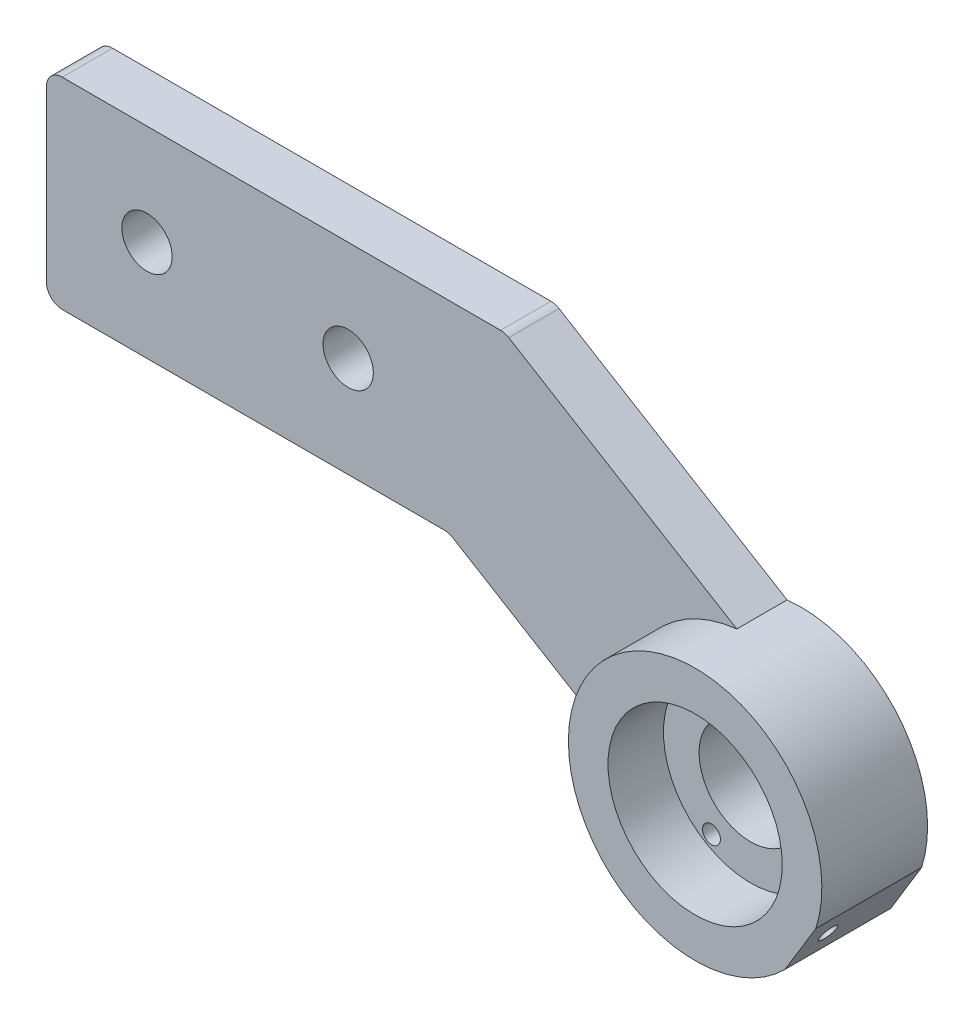
ISO-10303-21;
HEADER;
FILE_DESCRIPTION(('STEP AP214'),'2;1');
FILE_NAME('part.step','',(''),(''),'','','');
FILE_SCHEMA(('AUTOMOTIVE_DESIGN { 1 0 10303 214 1 1 1 1 }'));
ENDSEC;
DATA;
#1=APPLICATION_CONTEXT('core data for automotive mechanical design processes');
#2=APPLICATION_PROTOCOL_DEFINITION('international standard','automotive_design',2000,#1);
#3=PRODUCT_CONTEXT('',#1,'mechanical');
#4=PRODUCT('Part','Part','',(#3));
#5=PRODUCT_RELATED_PRODUCT_CATEGORY('part','',(#4));
#6=PRODUCT_DEFINITION_FORMATION('','',#4);
#7=PRODUCT_DEFINITION_CONTEXT('part definition',#1,'design');
#8=PRODUCT_DEFINITION('design','',#6,#7);
#9=PRODUCT_DEFINITION_SHAPE('','',#8);
#10=(LENGTH_UNIT() NAMED_UNIT(*) SI_UNIT(.MILLI.,.METRE.));
#11=(NAMED_UNIT(*) PLANE_ANGLE_UNIT() SI_UNIT($,.RADIAN.));
#12=(NAMED_UNIT(*) SI_UNIT($,.STERADIAN.) SOLID_ANGLE_UNIT());
#13=UNCERTAINTY_MEASURE_WITH_UNIT(LENGTH_MEASURE(1.E-05),#10,'distance_accuracy_value','');
#14=(GEOMETRIC_REPRESENTATION_CONTEXT(3) GLOBAL_UNCERTAINTY_ASSIGNED_CONTEXT((#13)) GLOBAL_UNIT_ASSIGNED_CONTEXT((#10,
#11,#12)) REPRESENTATION_CONTEXT('',''));
#15=CARTESIAN_POINT('',(0.,0.,0.));
#16=DIRECTION('',(0.,0.,1.));
#17=DIRECTION('',(1.,0.,0.));
#18=AXIS2_PLACEMENT_3D('',#15,#16,#17);
#19=CARTESIAN_POINT('',(50.8,-20.95,6.35));
#20=DIRECTION('',(0.,0.,-1.));
#21=DIRECTION('',(-1.,0.,0.));
#22=AXIS2_PLACEMENT_3D('',#19,#20,#21);
#23=PLANE('',#22);
#24=CARTESIAN_POINT('',(45.8613890575843,-29.0946759886107,6.35));
#25=DIRECTION('',(0.,0.,1.));
#26=DIRECTION('',(1.,0.,0.));
#27=AXIS2_PLACEMENT_3D('',#24,#25,#26);
#28=CIRCLE('',#27,1.1303);
#29=CARTESIAN_POINT('',(46.9916890575843,-29.0946759886107,6.35));
#30=VERTEX_POINT('',#29);
#31=EDGE_CURVE('E161',#30,#30,#28,.T.);
#32=ORIENTED_EDGE('',*,*,#31,.F.);
#33=EDGE_LOOP('',(#32));
#34=FACE_BOUND('',#33,.T.);
#35=CARTESIAN_POINT('',(55.7386109424157,-12.8053240113893,6.35));
#36=DIRECTION('',(0.,0.,1.));
#37=DIRECTION('',(1.,0.,0.));
#38=AXIS2_PLACEMENT_3D('',#35,#36,#37);
#39=CIRCLE('',#38,1.1303);
#40=CARTESIAN_POINT('',(56.8689109424157,-12.8053240113893,6.35));
#41=VERTEX_POINT('',#40);
#42=EDGE_CURVE('E167',#41,#41,#39,.T.);
#43=ORIENTED_EDGE('',*,*,#42,.F.);
#44=EDGE_LOOP('',(#43));
#45=FACE_BOUND('',#44,.T.);
#46=CARTESIAN_POINT('',(50.8,-20.95,6.35));
#47=DIRECTION('',(0.,0.,1.));
#48=DIRECTION('',(1.,0.,0.));
#49=AXIS2_PLACEMENT_3D('',#46,#47,#48);
#50=CIRCLE('',#49,6.5);
#51=CARTESIAN_POINT('',(57.3,-20.95,6.35));
#52=VERTEX_POINT('',#51);
#53=EDGE_CURVE('E179',#52,#52,#50,.T.);
#54=ORIENTED_EDGE('',*,*,#53,.F.);
#55=EDGE_LOOP('',(#54));
#56=FACE_BOUND('',#55,.T.);
#57=CARTESIAN_POINT('',(50.8,-20.95,6.35));
#58=DIRECTION('',(0.,0.,1.));
#59=DIRECTION('',(1.,0.,0.));
#60=AXIS2_PLACEMENT_3D('',#57,#58,#59);
#61=CIRCLE('',#60,11.);
#62=CARTESIAN_POINT('',(61.8,-20.95,6.35));
#63=VERTEX_POINT('',#62);
#64=EDGE_CURVE('E151',#63,#63,#61,.T.);
#65=ORIENTED_EDGE('',*,*,#64,.T.);
#66=EDGE_LOOP('',(#65));
#67=FACE_BOUND('',#66,.T.);
#68=ADVANCED_FACE('F34',(#34,#45,#56,#67),#23,.F.);
#69=CARTESIAN_POINT('',(50.8,-20.95,6.35));
#70=DIRECTION('',(0.,0.,1.));
#71=DIRECTION('',(1.,0.,0.));
#72=AXIS2_PLACEMENT_3D('',#69,#70,#71);
#73=CIRCLE('',#72,16.);
#74=CARTESIAN_POINT('',(49.0632163255362,-5.04454236847881,6.35));
#75=VERTEX_POINT('',#74);
#76=CARTESIAN_POINT('',(35.893587145761,-26.7636783381074,6.35));
#77=VERTEX_POINT('',#76);
#78=EDGE_CURVE('E12',#75,#77,#73,.T.);
#79=ORIENTED_EDGE('',*,*,#78,.F.);
#80=DIRECTION('',(-0.855084093292463,0.518489337786426,0.));
#81=VECTOR('',#80,1.);
#82=CARTESIAN_POINT('',(19.7992087244958,12.7,6.35));
#83=LINE('',#82,#81);
#84=CARTESIAN_POINT('',(20.2771945871162,12.4101681865849,6.35));
#85=VERTEX_POINT('',#84);
#86=EDGE_CURVE('E191',#75,#85,#83,.T.);
#87=ORIENTED_EDGE('',*,*,#86,.T.);
#88=CARTESIAN_POINT('',(19.2402159115434,10.7,6.35));
#89=DIRECTION('',(0.,0.,-1.));
#90=DIRECTION('',(-1.,0.,0.));
#91=AXIS2_PLACEMENT_3D('',#88,#89,#90);
#92=CIRCLE('',#91,2.);
#93=CARTESIAN_POINT('',(19.2402159115434,12.7,6.35));
#94=VERTEX_POINT('',#93);
#95=EDGE_CURVE('E235',#85,#94,#92,.F.);
#96=ORIENTED_EDGE('',*,*,#95,.T.);
#97=DIRECTION('',(-1.,0.,0.));
#98=VECTOR('',#97,1.);
#99=CARTESIAN_POINT('',(19.7992087244958,12.7,6.35));
#100=LINE('',#99,#98);
#101=CARTESIAN_POINT('',(-36.1,12.7,6.35));
#102=VERTEX_POINT('',#101);
#103=EDGE_CURVE('E194',#94,#102,#100,.T.);
#104=ORIENTED_EDGE('',*,*,#103,.T.);
#105=CARTESIAN_POINT('',(-36.1,10.7,6.35));
#106=DIRECTION('',(0.,0.,-1.));
#107=DIRECTION('',(-1.,0.,0.));
#108=AXIS2_PLACEMENT_3D('',#105,#106,#107);
#109=CIRCLE('',#108,2.);
#110=CARTESIAN_POINT('',(-38.1,10.7,6.35));
#111=VERTEX_POINT('',#110);
#112=EDGE_CURVE('E57',#102,#111,#109,.F.);
#113=ORIENTED_EDGE('',*,*,#112,.T.);
#114=DIRECTION('',(0.,-1.,0.));
#115=VECTOR('',#114,1.);
#116=CARTESIAN_POINT('',(-38.1,-12.7,6.35));
#117=LINE('',#116,#115);
#118=CARTESIAN_POINT('',(-38.1,-10.7,6.35));
#119=VERTEX_POINT('',#118);
#120=EDGE_CURVE('E196',#111,#119,#117,.T.);
#121=ORIENTED_EDGE('',*,*,#120,.T.);
#122=CARTESIAN_POINT('',(-36.1,-10.7,6.35));
#123=DIRECTION('',(0.,0.,-1.));
#124=DIRECTION('',(-1.,0.,0.));
#125=AXIS2_PLACEMENT_3D('',#122,#123,#124);
#126=CIRCLE('',#125,2.);
#127=CARTESIAN_POINT('',(-36.1,-12.7,6.35));
#128=VERTEX_POINT('',#127);
#129=EDGE_CURVE('E233',#119,#128,#126,.F.);
#130=ORIENTED_EDGE('',*,*,#129,.T.);
#131=DIRECTION('',(1.,0.,0.));
#132=VECTOR('',#131,1.);
#133=CARTESIAN_POINT('',(12.7,-12.7,6.35));
#134=LINE('',#133,#132);
#135=CARTESIAN_POINT('',(12.1410071870476,-12.7,6.35));
#136=VERTEX_POINT('',#135);
#137=EDGE_CURVE('E185',#128,#136,#134,.T.);
#138=ORIENTED_EDGE('',*,*,#137,.T.);
#139=CARTESIAN_POINT('',(12.1410071870476,-14.7,6.35));
#140=DIRECTION('',(0.,0.,-1.));
#141=DIRECTION('',(-1.,0.,0.));
#142=AXIS2_PLACEMENT_3D('',#139,#140,#141);
#143=CIRCLE('',#142,2.);
#144=CARTESIAN_POINT('',(13.1779858626204,-12.9898318134151,6.35));
#145=VERTEX_POINT('',#144);
#146=EDGE_CURVE('E38',#136,#145,#143,.T.);
#147=ORIENTED_EDGE('',*,*,#146,.T.);
#148=DIRECTION('',(0.855084093292463,-0.518489337786426,0.));
#149=VECTOR('',#148,1.);
#150=CARTESIAN_POINT('',(12.7,-12.7,6.35));
#151=LINE('',#150,#149);
#152=EDGE_CURVE('E188',#145,#77,#151,.T.);
#153=ORIENTED_EDGE('',*,*,#152,.T.);
#154=EDGE_LOOP('',(#79,#87,#96,#104,#113,#121,#130,#138,#147,#153));
#155=FACE_BOUND('',#154,.T.);
#156=CARTESIAN_POINT('',(-25.4,0.,6.35));
#157=DIRECTION('',(0.,0.,1.));
#158=DIRECTION('',(1.,0.,0.));
#159=AXIS2_PLACEMENT_3D('',#156,#157,#158);
#160=CIRCLE('',#159,3.175);
#161=CARTESIAN_POINT('',(-22.225,0.,6.35));
#162=VERTEX_POINT('',#161);
#163=EDGE_CURVE('E173',#162,#162,#160,.T.);
#164=ORIENTED_EDGE('',*,*,#163,.F.);
#165=EDGE_LOOP('',(#164));
#166=FACE_BOUND('',#165,.T.);
#167=CARTESIAN_POINT('',(0.,0.,6.35));
#168=DIRECTION('',(0.,0.,1.));
#169=DIRECTION('',(1.,0.,0.));
#170=AXIS2_PLACEMENT_3D('',#167,#168,#169);
#171=CIRCLE('',#170,3.175);
#172=CARTESIAN_POINT('',(3.175,0.,6.35));
#173=VERTEX_POINT('',#172);
#174=EDGE_CURVE('E155',#173,#173,#171,.T.);
#175=ORIENTED_EDGE('',*,*,#174,.F.);
#176=EDGE_LOOP('',(#175));
#177=FACE_BOUND('',#176,.T.);
#178=ADVANCED_FACE('F254',(#155,#166,#177),#23,.F.);
#179=CARTESIAN_POINT('',(50.8,-20.95,0.));
#180=DIRECTION('',(0.,0.,-1.));
#181=DIRECTION('',(-1.,0.,0.));
#182=AXIS2_PLACEMENT_3D('',#179,#180,#181);
#183=PLANE('',#182);
#184=CARTESIAN_POINT('',(45.8613890575843,-29.0946759886107,0.));
#185=DIRECTION('',(0.,0.,1.));
#186=DIRECTION('',(1.,0.,0.));
#187=AXIS2_PLACEMENT_3D('',#184,#185,#186);
#188=CIRCLE('',#187,1.1303);
#189=CARTESIAN_POINT('',(46.9916890575843,-29.0946759886107,0.));
#190=VERTEX_POINT('',#189);
#191=EDGE_CURVE('E158',#190,#190,#188,.T.);
#192=ORIENTED_EDGE('',*,*,#191,.T.);
#193=EDGE_LOOP('',(#192));
#194=FACE_BOUND('',#193,.T.);
#195=CARTESIAN_POINT('',(-25.4,0.,0.));
#196=DIRECTION('',(0.,0.,1.));
#197=DIRECTION('',(1.,0.,0.));
#198=AXIS2_PLACEMENT_3D('',#195,#196,#197);
#199=CIRCLE('',#198,3.175);
#200=CARTESIAN_POINT('',(-22.225,0.,0.));
#201=VERTEX_POINT('',#200);
#202=EDGE_CURVE('E170',#201,#201,#199,.T.);
#203=ORIENTED_EDGE('',*,*,#202,.T.);
#204=EDGE_LOOP('',(#203));
#205=FACE_BOUND('',#204,.T.);
#206=DIRECTION('',(-1.,0.,0.));
#207=VECTOR('',#206,1.);
#208=CARTESIAN_POINT('',(19.7992087244958,12.7,0.));
#209=LINE('',#208,#207);
#210=CARTESIAN_POINT('',(19.2402159115434,12.7,0.));
#211=VERTEX_POINT('',#210);
#212=CARTESIAN_POINT('',(-36.1,12.7,0.));
#213=VERTEX_POINT('',#212);
#214=EDGE_CURVE('E211',#211,#213,#209,.T.);
#215=ORIENTED_EDGE('',*,*,#214,.F.);
#216=CARTESIAN_POINT('',(19.2402159115434,10.7,0.));
#217=DIRECTION('',(0.,0.,-1.));
#218=DIRECTION('',(-1.,0.,0.));
#219=AXIS2_PLACEMENT_3D('',#216,#217,#218);
#220=CIRCLE('',#219,2.);
#221=CARTESIAN_POINT('',(20.2771945871162,12.4101681865849,0.));
#222=VERTEX_POINT('',#221);
#223=EDGE_CURVE('E228',#211,#222,#220,.T.);
#224=ORIENTED_EDGE('',*,*,#223,.T.);
#225=DIRECTION('',(-0.855084093292463,0.518489337786426,0.));
#226=VECTOR('',#225,1.);
#227=CARTESIAN_POINT('',(19.7992087244958,12.7,0.));
#228=LINE('',#227,#226);
#229=CARTESIAN_POINT('',(49.0632163255362,-5.04454236847881,0.));
#230=VERTEX_POINT('',#229);
#231=EDGE_CURVE('E208',#230,#222,#228,.T.);
#232=ORIENTED_EDGE('',*,*,#231,.F.);
#233=CARTESIAN_POINT('',(50.8,-20.95,0.));
#234=DIRECTION('',(0.,0.,1.));
#235=DIRECTION('',(-1.,0.,0.));
#236=AXIS2_PLACEMENT_3D('',#233,#234,#235);
#237=CIRCLE('',#236,16.);
#238=CARTESIAN_POINT('',(66.0446039292896,-25.8081942158675,0.));
#239=VERTEX_POINT('',#238);
#240=EDGE_CURVE('E206',#239,#230,#237,.T.);
#241=ORIENTED_EDGE('',*,*,#240,.F.);
#242=DIRECTION('',(0.518489337786426,0.855084093292463,0.));
#243=VECTOR('',#242,1.);
#244=CARTESIAN_POINT('',(66.0446039292896,-25.8081942158675,0.));
#245=LINE('',#244,#243);
#246=CARTESIAN_POINT('',(62.1559338958914,-32.2213249155609,0.));
#247=VERTEX_POINT('',#246);
#248=EDGE_CURVE('E204',#247,#239,#245,.T.);
#249=ORIENTED_EDGE('',*,*,#248,.F.);
#250=CARTESIAN_POINT('',(50.8,-20.95,0.));
#251=DIRECTION('',(0.,0.,1.));
#252=DIRECTION('',(-1.,0.,0.));
#253=AXIS2_PLACEMENT_3D('',#250,#251,#252);
#254=CIRCLE('',#253,16.);
#255=CARTESIAN_POINT('',(35.893587145761,-26.7636783381074,0.));
#256=VERTEX_POINT('',#255);
#257=EDGE_CURVE('E134',#256,#247,#254,.T.);
#258=ORIENTED_EDGE('',*,*,#257,.F.);
#259=DIRECTION('',(0.855084093292463,-0.518489337786426,0.));
#260=VECTOR('',#259,1.);
#261=CARTESIAN_POINT('',(12.7,-12.7,0.));
#262=LINE('',#261,#260);
#263=CARTESIAN_POINT('',(13.1779858626204,-12.9898318134151,0.));
#264=VERTEX_POINT('',#263);
#265=EDGE_CURVE('E201',#264,#256,#262,.T.);
#266=ORIENTED_EDGE('',*,*,#265,.F.);
#267=CARTESIAN_POINT('',(12.1410071870476,-14.7,0.));
#268=DIRECTION('',(0.,0.,-1.));
#269=DIRECTION('',(-1.,0.,0.));
#270=AXIS2_PLACEMENT_3D('',#267,#268,#269);
#271=CIRCLE('',#270,2.);
#272=CARTESIAN_POINT('',(12.1410071870476,-12.7,0.));
#273=VERTEX_POINT('',#272);
#274=EDGE_CURVE('E248',#264,#273,#271,.F.);
#275=ORIENTED_EDGE('',*,*,#274,.T.);
#276=DIRECTION('',(1.,0.,0.));
#277=VECTOR('',#276,1.);
#278=CARTESIAN_POINT('',(12.7,-12.7,0.));
#279=LINE('',#278,#277);
#280=CARTESIAN_POINT('',(-36.1,-12.7,0.));
#281=VERTEX_POINT('',#280);
#282=EDGE_CURVE('E182',#281,#273,#279,.T.);
#283=ORIENTED_EDGE('',*,*,#282,.F.);
#284=CARTESIAN_POINT('',(-36.1,-10.7,0.));
#285=DIRECTION('',(0.,0.,-1.));
#286=DIRECTION('',(-1.,0.,0.));
#287=AXIS2_PLACEMENT_3D('',#284,#285,#286);
#288=CIRCLE('',#287,2.);
#289=CARTESIAN_POINT('',(-38.1,-10.7,0.));
#290=VERTEX_POINT('',#289);
#291=EDGE_CURVE('E226',#281,#290,#288,.T.);
#292=ORIENTED_EDGE('',*,*,#291,.T.);
#293=DIRECTION('',(0.,-1.,0.));
#294=VECTOR('',#293,1.);
#295=CARTESIAN_POINT('',(-38.1,-12.7,0.));
#296=LINE('',#295,#294);
#297=CARTESIAN_POINT('',(-38.1,10.7,0.));
#298=VERTEX_POINT('',#297);
#299=EDGE_CURVE('E189',#298,#290,#296,.T.);
#300=ORIENTED_EDGE('',*,*,#299,.F.);
#301=CARTESIAN_POINT('',(-36.1,10.7,0.));
#302=DIRECTION('',(0.,0.,-1.));
#303=DIRECTION('',(-1.,0.,0.));
#304=AXIS2_PLACEMENT_3D('',#301,#302,#303);
#305=CIRCLE('',#304,2.);
#306=EDGE_CURVE('E224',#298,#213,#305,.T.);
#307=ORIENTED_EDGE('',*,*,#306,.T.);
#308=EDGE_LOOP('',(#215,#224,#232,#241,#249,#258,#266,#275,#283,#292,#300,#307));
#309=FACE_BOUND('',#308,.T.);
#310=CARTESIAN_POINT('',(50.8,-20.95,0.));
#311=DIRECTION('',(0.,0.,1.));
#312=DIRECTION('',(1.,0.,0.));
#313=AXIS2_PLACEMENT_3D('',#310,#311,#312);
#314=CIRCLE('',#313,6.5);
#315=CARTESIAN_POINT('',(57.3,-20.95,0.));
#316=VERTEX_POINT('',#315);
#317=EDGE_CURVE('E176',#316,#316,#314,.T.);
#318=ORIENTED_EDGE('',*,*,#317,.T.);
#319=EDGE_LOOP('',(#318));
#320=FACE_BOUND('',#319,.T.);
#321=CARTESIAN_POINT('',(55.7386109424157,-12.8053240113893,0.));
#322=DIRECTION('',(0.,0.,1.));
#323=DIRECTION('',(1.,0.,0.));
#324=AXIS2_PLACEMENT_3D('',#321,#322,#323);
#325=CIRCLE('',#324,1.1303);
#326=CARTESIAN_POINT('',(56.8689109424157,-12.8053240113893,0.));
#327=VERTEX_POINT('',#326);
#328=EDGE_CURVE('E164',#327,#327,#325,.T.);
#329=ORIENTED_EDGE('',*,*,#328,.T.);
#330=EDGE_LOOP('',(#329));
#331=FACE_BOUND('',#330,.T.);
#332=CARTESIAN_POINT('',(0.,0.,0.));
#333=DIRECTION('',(0.,0.,1.));
#334=DIRECTION('',(1.,0.,0.));
#335=AXIS2_PLACEMENT_3D('',#332,#333,#334);
#336=CIRCLE('',#335,3.175);
#337=CARTESIAN_POINT('',(3.175,0.,0.));
#338=VERTEX_POINT('',#337);
#339=EDGE_CURVE('E144',#338,#338,#336,.T.);
#340=ORIENTED_EDGE('',*,*,#339,.T.);
#341=EDGE_LOOP('',(#340));
#342=FACE_BOUND('',#341,.T.);
#343=ADVANCED_FACE('F268',(#194,#205,#309,#320,#331,#342),#183,.T.);
#344=CARTESIAN_POINT('',(12.7,-12.7,6.35));
#345=DIRECTION('',(0.,1.,0.));
#346=DIRECTION('',(-1.,0.,0.));
#347=AXIS2_PLACEMENT_3D('',#344,#345,#346);
#348=PLANE('',#347);
#349=ORIENTED_EDGE('',*,*,#282,.T.);
#350=DIRECTION('',(0.,0.,-1.));
#351=VECTOR('',#350,1.);
#352=CARTESIAN_POINT('',(12.1410071870476,-12.7,6.35));
#353=LINE('',#352,#351);
#354=EDGE_CURVE('E243',#273,#136,#353,.F.);
#355=ORIENTED_EDGE('',*,*,#354,.T.);
#356=ORIENTED_EDGE('',*,*,#137,.F.);
#357=DIRECTION('',(0.,0.,-1.));
#358=VECTOR('',#357,1.);
#359=CARTESIAN_POINT('',(-36.1,-12.7,6.35));
#360=LINE('',#359,#358);
#361=EDGE_CURVE('E240',#128,#281,#360,.T.);
#362=ORIENTED_EDGE('',*,*,#361,.T.);
#363=EDGE_LOOP('',(#349,#355,#356,#362));
#364=FACE_BOUND('',#363,.T.);
#365=ADVANCED_FACE('F265',(#364),#348,.F.);
#366=CARTESIAN_POINT('',(12.7,-12.7,6.35));
#367=DIRECTION('',(0.518489337786426,0.855084093292463,0.));
#368=DIRECTION('',(-0.855084093292463,0.518489337786426,0.));
#369=AXIS2_PLACEMENT_3D('',#366,#367,#368);
#370=PLANE('',#369);
#371=ORIENTED_EDGE('',*,*,#152,.F.);
#372=DIRECTION('',(0.,0.,-1.));
#373=VECTOR('',#372,1.);
#374=CARTESIAN_POINT('',(13.1779858626204,-12.9898318134151,0.));
#375=LINE('',#374,#373);
#376=EDGE_CURVE('E237',#145,#264,#375,.T.);
#377=ORIENTED_EDGE('',*,*,#376,.T.);
#378=ORIENTED_EDGE('',*,*,#265,.T.);
#379=DIRECTION('',(0.,0.,-1.));
#380=VECTOR('',#379,1.);
#381=CARTESIAN_POINT('',(35.893587145761,-26.7636783381074,6.35));
#382=LINE('',#381,#380);
#383=EDGE_CURVE('E137',#77,#256,#382,.T.);
#384=ORIENTED_EDGE('',*,*,#383,.F.);
#385=EDGE_LOOP('',(#371,#377,#378,#384));
#386=FACE_BOUND('',#385,.T.);
#387=ADVANCED_FACE('F262',(#386),#370,.F.);
#388=CARTESIAN_POINT('',(66.0446039292896,-25.8081942158675,6.35));
#389=DIRECTION('',(-0.855084093292463,0.518489337786426,0.));
#390=DIRECTION('',(-0.518489337786426,-0.855084093292463,0.));
#391=AXIS2_PLACEMENT_3D('',#388,#389,#390);
#392=PLANE('',#391);
#393=CARTESIAN_POINT('',(64.1002689125905,-29.0147595657142,9.85));
#394=DIRECTION('',(0.855084093292463,-0.518489337786426,0.));
#395=DIRECTION('',(0.518489337786426,0.855084093292463,0.));
#396=AXIS2_PLACEMENT_3D('',#393,#394,#395);
#397=CIRCLE('',#396,1.1303);
#398=CARTESIAN_POINT('',(64.6863174110905,-28.0482580150657,9.85));
#399=VERTEX_POINT('',#398);
#400=EDGE_CURVE('E360',#399,#399,#397,.T.);
#401=ORIENTED_EDGE('',*,*,#400,.F.);
#402=EDGE_LOOP('',(#401));
#403=FACE_BOUND('',#402,.T.);
#404=ORIENTED_EDGE('',*,*,#248,.T.);
#405=DIRECTION('',(0.,0.,-1.));
#406=VECTOR('',#405,1.);
#407=CARTESIAN_POINT('',(66.0446039292896,-25.8081942158675,6.35));
#408=LINE('',#407,#406);
#409=CARTESIAN_POINT('',(66.0446039292896,-25.8081942158675,13.35));
#410=VERTEX_POINT('',#409);
#411=EDGE_CURVE('E138',#410,#239,#408,.T.);
#412=ORIENTED_EDGE('',*,*,#411,.F.);
#413=DIRECTION('',(0.518489337786425,0.855084093292463,0.));
#414=VECTOR('',#413,1.);
#415=CARTESIAN_POINT('',(66.0446039292896,-25.8081942158675,13.35));
#416=LINE('',#415,#414);
#417=CARTESIAN_POINT('',(62.1559338958914,-32.2213249155609,13.35));
#418=VERTEX_POINT('',#417);
#419=EDGE_CURVE('E141',#418,#410,#416,.T.);
#420=ORIENTED_EDGE('',*,*,#419,.F.);
#421=DIRECTION('',(0.,0.,-1.));
#422=VECTOR('',#421,1.);
#423=CARTESIAN_POINT('',(62.1559338958914,-32.2213249155609,6.35));
#424=LINE('',#423,#422);
#425=EDGE_CURVE('E126',#418,#247,#424,.T.);
#426=ORIENTED_EDGE('',*,*,#425,.T.);
#427=EDGE_LOOP('',(#404,#412,#420,#426));
#428=FACE_BOUND('',#427,.T.);
#429=ADVANCED_FACE('F142',(#403,#428),#392,.F.);
#430=CARTESIAN_POINT('',(50.8,-20.95,6.35));
#431=DIRECTION('',(0.,0.,-1.));
#432=DIRECTION('',(-1.,0.,0.));
#433=AXIS2_PLACEMENT_3D('',#430,#431,#432);
#434=CYLINDRICAL_SURFACE('',#433,16.);
#435=ORIENTED_EDGE('',*,*,#240,.T.);
#436=DIRECTION('',(0.,0.,-1.));
#437=VECTOR('',#436,1.);
#438=CARTESIAN_POINT('',(49.0632163255362,-5.04454236847881,6.35));
#439=LINE('',#438,#437);
#440=EDGE_CURVE('E198',#75,#230,#439,.T.);
#441=ORIENTED_EDGE('',*,*,#440,.F.);
#442=ORIENTED_EDGE('',*,*,#78,.T.);
#443=ORIENTED_EDGE('',*,*,#383,.T.);
#444=ORIENTED_EDGE('',*,*,#257,.T.);
#445=ORIENTED_EDGE('',*,*,#425,.F.);
#446=CARTESIAN_POINT('',(50.8,-20.95,13.35));
#447=DIRECTION('',(0.,0.,1.));
#448=DIRECTION('',(1.,0.,0.));
#449=AXIS2_PLACEMENT_3D('',#446,#447,#448);
#450=CIRCLE('',#449,16.);
#451=EDGE_CURVE('E131',#410,#418,#450,.T.);
#452=ORIENTED_EDGE('',*,*,#451,.F.);
#453=ORIENTED_EDGE('',*,*,#411,.T.);
#454=EDGE_LOOP('',(#435,#441,#442,#443,#444,#445,#452,#453));
#455=FACE_BOUND('',#454,.T.);
#456=ADVANCED_FACE('F128',(#455),#434,.T.);
#457=CARTESIAN_POINT('',(19.7992087244958,12.7,6.35));
#458=DIRECTION('',(-0.518489337786426,-0.855084093292463,0.));
#459=DIRECTION('',(0.855084093292463,-0.518489337786426,0.));
#460=AXIS2_PLACEMENT_3D('',#457,#458,#459);
#461=PLANE('',#460);
#462=ORIENTED_EDGE('',*,*,#231,.T.);
#463=DIRECTION('',(0.,0.,-1.));
#464=VECTOR('',#463,1.);
#465=CARTESIAN_POINT('',(20.2771945871162,12.4101681865849,6.35));
#466=LINE('',#465,#464);
#467=EDGE_CURVE('E230',#222,#85,#466,.F.);
#468=ORIENTED_EDGE('',*,*,#467,.T.);
#469=ORIENTED_EDGE('',*,*,#86,.F.);
#470=ORIENTED_EDGE('',*,*,#440,.T.);
#471=EDGE_LOOP('',(#462,#468,#469,#470));
#472=FACE_BOUND('',#471,.T.);
#473=ADVANCED_FACE('F289',(#472),#461,.F.);
#474=CARTESIAN_POINT('',(19.7992087244958,12.7,6.35));
#475=DIRECTION('',(0.,-1.,0.));
#476=DIRECTION('',(1.,0.,0.));
#477=AXIS2_PLACEMENT_3D('',#474,#475,#476);
#478=PLANE('',#477);
#479=ORIENTED_EDGE('',*,*,#103,.F.);
#480=DIRECTION('',(0.,0.,-1.));
#481=VECTOR('',#480,1.);
#482=CARTESIAN_POINT('',(19.2402159115434,12.7,6.35));
#483=LINE('',#482,#481);
#484=EDGE_CURVE('E221',#94,#211,#483,.T.);
#485=ORIENTED_EDGE('',*,*,#484,.T.);
#486=ORIENTED_EDGE('',*,*,#214,.T.);
#487=DIRECTION('',(0.,0.,-1.));
#488=VECTOR('',#487,1.);
#489=CARTESIAN_POINT('',(-36.1,12.7,6.35));
#490=LINE('',#489,#488);
#491=EDGE_CURVE('E219',#213,#102,#490,.F.);
#492=ORIENTED_EDGE('',*,*,#491,.T.);
#493=EDGE_LOOP('',(#479,#485,#486,#492));
#494=FACE_BOUND('',#493,.T.);
#495=ADVANCED_FACE('F280',(#494),#478,.F.);
#496=CARTESIAN_POINT('',(-38.1,-12.7,6.35));
#497=DIRECTION('',(1.,0.,0.));
#498=DIRECTION('',(0.,0.,-1.));
#499=AXIS2_PLACEMENT_3D('',#496,#497,#498);
#500=PLANE('',#499);
#501=ORIENTED_EDGE('',*,*,#299,.T.);
#502=DIRECTION('',(0.,0.,-1.));
#503=VECTOR('',#502,1.);
#504=CARTESIAN_POINT('',(-38.1,-10.7,6.35));
#505=LINE('',#504,#503);
#506=EDGE_CURVE('E50',#290,#119,#505,.F.);
#507=ORIENTED_EDGE('',*,*,#506,.T.);
#508=ORIENTED_EDGE('',*,*,#120,.F.);
#509=DIRECTION('',(0.,0.,-1.));
#510=VECTOR('',#509,1.);
#511=CARTESIAN_POINT('',(-38.1,10.7,6.35));
#512=LINE('',#511,#510);
#513=EDGE_CURVE('E245',#111,#298,#512,.T.);
#514=ORIENTED_EDGE('',*,*,#513,.T.);
#515=EDGE_LOOP('',(#501,#507,#508,#514));
#516=FACE_BOUND('',#515,.T.);
#517=ADVANCED_FACE('F272',(#516),#500,.F.);
#518=CARTESIAN_POINT('',(50.8,-20.95,6.35));
#519=DIRECTION('',(0.,0.,-1.));
#520=DIRECTION('',(-1.,0.,0.));
#521=AXIS2_PLACEMENT_3D('',#518,#519,#520);
#522=CYLINDRICAL_SURFACE('',#521,6.5);
#523=ORIENTED_EDGE('',*,*,#53,.T.);
#524=EDGE_LOOP('',(#523));
#525=FACE_BOUND('',#524,.T.);
#526=ORIENTED_EDGE('',*,*,#317,.F.);
#527=EDGE_LOOP('',(#526));
#528=FACE_BOUND('',#527,.T.);
#529=ADVANCED_FACE('F310',(#525,#528),#522,.F.);
#530=CARTESIAN_POINT('',(-25.4,0.,6.35));
#531=DIRECTION('',(0.,0.,-1.));
#532=DIRECTION('',(-1.,0.,0.));
#533=AXIS2_PLACEMENT_3D('',#530,#531,#532);
#534=CYLINDRICAL_SURFACE('',#533,3.175);
#535=ORIENTED_EDGE('',*,*,#163,.T.);
#536=EDGE_LOOP('',(#535));
#537=FACE_BOUND('',#536,.T.);
#538=ORIENTED_EDGE('',*,*,#202,.F.);
#539=EDGE_LOOP('',(#538));
#540=FACE_BOUND('',#539,.T.);
#541=ADVANCED_FACE('F319',(#537,#540),#534,.F.);
#542=CARTESIAN_POINT('',(55.7386109424157,-12.8053240113893,6.35));
#543=DIRECTION('',(0.,0.,-1.));
#544=DIRECTION('',(-1.,0.,0.));
#545=AXIS2_PLACEMENT_3D('',#542,#543,#544);
#546=CYLINDRICAL_SURFACE('',#545,1.1303);
#547=ORIENTED_EDGE('',*,*,#42,.T.);
#548=EDGE_LOOP('',(#547));
#549=FACE_BOUND('',#548,.T.);
#550=ORIENTED_EDGE('',*,*,#328,.F.);
#551=EDGE_LOOP('',(#550));
#552=FACE_BOUND('',#551,.T.);
#553=ADVANCED_FACE('F324',(#549,#552),#546,.F.);
#554=CARTESIAN_POINT('',(45.8613890575843,-29.0946759886107,6.35));
#555=DIRECTION('',(0.,0.,-1.));
#556=DIRECTION('',(-1.,0.,0.));
#557=AXIS2_PLACEMENT_3D('',#554,#555,#556);
#558=CYLINDRICAL_SURFACE('',#557,1.1303);
#559=ORIENTED_EDGE('',*,*,#31,.T.);
#560=EDGE_LOOP('',(#559));
#561=FACE_BOUND('',#560,.T.);
#562=ORIENTED_EDGE('',*,*,#191,.F.);
#563=EDGE_LOOP('',(#562));
#564=FACE_BOUND('',#563,.T.);
#565=ADVANCED_FACE('F336',(#561,#564),#558,.F.);
#566=CARTESIAN_POINT('',(0.,0.,6.35));
#567=DIRECTION('',(0.,0.,-1.));
#568=DIRECTION('',(-1.,0.,0.));
#569=AXIS2_PLACEMENT_3D('',#566,#567,#568);
#570=CYLINDRICAL_SURFACE('',#569,3.175);
#571=ORIENTED_EDGE('',*,*,#174,.T.);
#572=EDGE_LOOP('',(#571));
#573=FACE_BOUND('',#572,.T.);
#574=ORIENTED_EDGE('',*,*,#339,.F.);
#575=EDGE_LOOP('',(#574));
#576=FACE_BOUND('',#575,.T.);
#577=ADVANCED_FACE('F334',(#573,#576),#570,.F.);
#578=CARTESIAN_POINT('',(19.2402159115434,10.7,6.35));
#579=DIRECTION('',(0.,0.,-1.));
#580=DIRECTION('',(-1.,0.,0.));
#581=AXIS2_PLACEMENT_3D('',#578,#579,#580);
#582=CYLINDRICAL_SURFACE('',#581,2.);
#583=ORIENTED_EDGE('',*,*,#95,.F.);
#584=ORIENTED_EDGE('',*,*,#467,.F.);
#585=ORIENTED_EDGE('',*,*,#223,.F.);
#586=ORIENTED_EDGE('',*,*,#484,.F.);
#587=EDGE_LOOP('',(#583,#584,#585,#586));
#588=FACE_BOUND('',#587,.T.);
#589=ADVANCED_FACE('F284',(#588),#582,.T.);
#590=CARTESIAN_POINT('',(12.1410071870476,-14.7,6.35));
#591=DIRECTION('',(0.,0.,1.));
#592=DIRECTION('',(1.,0.,0.));
#593=AXIS2_PLACEMENT_3D('',#590,#591,#592);
#594=CYLINDRICAL_SURFACE('',#593,2.);
#595=ORIENTED_EDGE('',*,*,#146,.F.);
#596=ORIENTED_EDGE('',*,*,#354,.F.);
#597=ORIENTED_EDGE('',*,*,#274,.F.);
#598=ORIENTED_EDGE('',*,*,#376,.F.);
#599=EDGE_LOOP('',(#595,#596,#597,#598));
#600=FACE_BOUND('',#599,.T.);
#601=ADVANCED_FACE('F263',(#600),#594,.F.);
#602=CARTESIAN_POINT('',(-36.1,-10.7,6.35));
#603=DIRECTION('',(0.,0.,-1.));
#604=DIRECTION('',(-1.,0.,0.));
#605=AXIS2_PLACEMENT_3D('',#602,#603,#604);
#606=CYLINDRICAL_SURFACE('',#605,2.);
#607=ORIENTED_EDGE('',*,*,#129,.F.);
#608=ORIENTED_EDGE('',*,*,#506,.F.);
#609=ORIENTED_EDGE('',*,*,#291,.F.);
#610=ORIENTED_EDGE('',*,*,#361,.F.);
#611=EDGE_LOOP('',(#607,#608,#609,#610));
#612=FACE_BOUND('',#611,.T.);
#613=ADVANCED_FACE('F275',(#612),#606,.T.);
#614=CARTESIAN_POINT('',(-36.1,10.7,6.35));
#615=DIRECTION('',(0.,0.,-1.));
#616=DIRECTION('',(-1.,0.,0.));
#617=AXIS2_PLACEMENT_3D('',#614,#615,#616);
#618=CYLINDRICAL_SURFACE('',#617,2.);
#619=ORIENTED_EDGE('',*,*,#112,.F.);
#620=ORIENTED_EDGE('',*,*,#491,.F.);
#621=ORIENTED_EDGE('',*,*,#306,.F.);
#622=ORIENTED_EDGE('',*,*,#513,.F.);
#623=EDGE_LOOP('',(#619,#620,#621,#622));
#624=FACE_BOUND('',#623,.T.);
#625=ADVANCED_FACE('F36',(#624),#618,.T.);
#626=CARTESIAN_POINT('',(50.8,-20.95,13.35));
#627=DIRECTION('',(0.,0.,1.));
#628=DIRECTION('',(1.,0.,0.));
#629=AXIS2_PLACEMENT_3D('',#626,#627,#628);
#630=PLANE('',#629);
#631=ORIENTED_EDGE('',*,*,#451,.T.);
#632=ORIENTED_EDGE('',*,*,#419,.T.);
#633=EDGE_LOOP('',(#631,#632));
#634=FACE_BOUND('',#633,.T.);
#635=CARTESIAN_POINT('',(50.8,-20.95,13.35));
#636=DIRECTION('',(0.,0.,1.));
#637=DIRECTION('',(1.,0.,0.));
#638=AXIS2_PLACEMENT_3D('',#635,#636,#637);
#639=CIRCLE('',#638,11.);
#640=CARTESIAN_POINT('',(61.8,-20.95,13.35));
#641=VERTEX_POINT('',#640);
#642=EDGE_CURVE('E148',#641,#641,#639,.T.);
#643=ORIENTED_EDGE('',*,*,#642,.F.);
#644=EDGE_LOOP('',(#643));
#645=FACE_BOUND('',#644,.T.);
#646=ADVANCED_FACE('F146',(#634,#645),#630,.T.);
#647=CARTESIAN_POINT('',(50.8,-20.95,13.35));
#648=DIRECTION('',(0.,0.,-1.));
#649=DIRECTION('',(-1.,0.,0.));
#650=AXIS2_PLACEMENT_3D('',#647,#648,#649);
#651=CYLINDRICAL_SURFACE('',#650,11.);
#652=CARTESIAN_POINT('',(60.7421855406457,-25.6566916911325,9.85));
#653=CARTESIAN_POINT('',(60.7421847722216,-25.6566944269906,9.91330937527179));
#654=CARTESIAN_POINT('',(60.7398932857835,-25.6615432044217,9.97666038361784));
#655=CARTESIAN_POINT('',(60.7307476425883,-25.6807885587255,10.1016053119427));
#656=CARTESIAN_POINT('',(60.7238884834253,-25.6951956035195,10.1631972281942));
#657=CARTESIAN_POINT('',(60.7056929808326,-25.7330623146684,10.2827965277183));
#658=CARTESIAN_POINT('',(60.6943593837912,-25.7565164277744,10.3408060846153));
#659=CARTESIAN_POINT('',(60.6673644005523,-25.8116929759155,10.4516370410492));
#660=CARTESIAN_POINT('',(60.6517038619199,-25.8434137915929,10.5044594539046));
#661=CARTESIAN_POINT('',(60.6162153258096,-25.9142205499615,10.6036314163938));
#662=CARTESIAN_POINT('',(60.5963733052074,-25.9533312286581,10.6499582891129));
#663=CARTESIAN_POINT('',(60.5528713981434,-26.0376068611052,10.734628786234));
#664=CARTESIAN_POINT('',(60.5292113356148,-26.0827720940415,10.7729720422895));
#665=CARTESIAN_POINT('',(60.4784501539972,-26.1778589436466,10.8406656002267));
#666=CARTESIAN_POINT('',(60.4513415240713,-26.2277908809134,10.8699957809215));
#667=CARTESIAN_POINT('',(60.3942954536691,-26.3307952036498,10.9187018718876));
#668=CARTESIAN_POINT('',(60.3643580857336,-26.383867508574,10.9380780373396));
#669=CARTESIAN_POINT('',(60.3024800453182,-26.491362955833,10.9662594295133));
#670=CARTESIAN_POINT('',(60.2705468650886,-26.54578063133,10.9751019541039));
#671=CARTESIAN_POINT('',(60.2054290739639,-26.6545526535063,10.9820804824775));
#672=CARTESIAN_POINT('',(60.1722444972128,-26.7089070018718,10.9802167781671));
#673=CARTESIAN_POINT('',(60.1057136500006,-26.8158028653165,10.965865991336));
#674=CARTESIAN_POINT('',(60.0723684619577,-26.8683504462751,10.9534190160047));
#675=CARTESIAN_POINT('',(60.0064254061933,-26.9704173787112,10.9183175140494));
#676=CARTESIAN_POINT('',(59.9738275486486,-27.0199366889665,10.8956628485092));
#677=CARTESIAN_POINT('',(59.9103910561834,-27.1147414856166,10.8407452055061));
#678=CARTESIAN_POINT('',(59.879555789597,-27.1600189647736,10.8084645190244));
#679=CARTESIAN_POINT('',(59.8207755171047,-27.245100250556,10.735224025441));
#680=CARTESIAN_POINT('',(59.7928306007713,-27.2849038875585,10.6942639494832));
#681=CARTESIAN_POINT('',(59.7407206839725,-27.3582408735815,10.6046019114445));
#682=CARTESIAN_POINT('',(59.7165737447462,-27.3917444017219,10.5558650532729));
#683=CARTESIAN_POINT('',(59.6731342894381,-27.4514502604216,10.4521537887632));
#684=CARTESIAN_POINT('',(59.6538417810589,-27.4776525793958,10.397179372528));
#685=CARTESIAN_POINT('',(59.6208697890934,-27.5221402019331,10.2825262968801));
#686=CARTESIAN_POINT('',(59.6071915911622,-27.5404236921682,10.2228465636938));
#687=CARTESIAN_POINT('',(59.5860145304009,-27.5686299594266,10.1004904692981));
#688=CARTESIAN_POINT('',(59.5785154685605,-27.5785530057134,10.0378142046661));
#689=CARTESIAN_POINT('',(59.5700293564084,-27.5897767504576,9.9115504478728));
#690=CARTESIAN_POINT('',(59.5690127405562,-27.5911165958385,9.84796842031964));
#691=CARTESIAN_POINT('',(59.5734553108332,-27.5852464104059,9.72142920924612));
#692=CARTESIAN_POINT('',(59.5789144044816,-27.5780365016929,9.65847201681533));
#693=CARTESIAN_POINT('',(59.596061358768,-27.5552634243568,9.53511225084132));
#694=CARTESIAN_POINT('',(59.6077353283294,-27.5397188841947,9.47470430311385));
#695=CARTESIAN_POINT('',(59.6368282935195,-27.5006530511608,9.35799062780025));
#696=CARTESIAN_POINT('',(59.6542474278547,-27.4771315656999,9.30168499929713));
#697=CARTESIAN_POINT('',(59.6942152930527,-27.4225634702725,9.19455198879852));
#698=CARTESIAN_POINT('',(59.7167822336993,-27.3914901202811,9.14374502175224));
#699=CARTESIAN_POINT('',(59.7661467999623,-27.3225977980833,9.04925870601754));
#700=CARTESIAN_POINT('',(59.792944536213,-27.2847786494726,9.00557954378006));
#701=CARTESIAN_POINT('',(59.8498945018874,-27.2031504671346,8.92642011830135));
#702=CARTESIAN_POINT('',(59.8800591186765,-27.1593191686326,8.8909717153932));
#703=CARTESIAN_POINT('',(59.9425885357086,-27.066877019389,8.82949941990833));
#704=CARTESIAN_POINT('',(59.9749533043385,-27.0182662373172,8.80347539195079));
#705=CARTESIAN_POINT('',(60.0407252018615,-26.9176294576661,8.7616444211739));
#706=CARTESIAN_POINT('',(60.0741302516416,-26.8656100682203,8.74581831800913));
#707=CARTESIAN_POINT('',(60.1409725847966,-26.7594889245023,8.72476992835101));
#708=CARTESIAN_POINT('',(60.1744098671818,-26.7053872323034,8.71954732601679));
#709=CARTESIAN_POINT('',(60.2401663605815,-26.5968810267548,8.71985877245698));
#710=CARTESIAN_POINT('',(60.2724900114455,-26.5424790553788,8.72534339492369));
#711=CARTESIAN_POINT('',(60.3353022490352,-26.4346971814868,8.74680985561379));
#712=CARTESIAN_POINT('',(60.3657908345457,-26.3813172796474,8.76279170078789));
#713=CARTESIAN_POINT('',(60.4241818583206,-26.2771653292599,8.80478505825631));
#714=CARTESIAN_POINT('',(60.45208469302,-26.2263928814831,8.8307950299199));
#715=CARTESIAN_POINT('',(60.5047050449474,-26.1289737329372,8.8921010726687));
#716=CARTESIAN_POINT('',(60.5294225750905,-26.0823270154404,8.92739710610122));
#717=CARTESIAN_POINT('',(60.5753056435877,-25.9943903925834,9.00645849804621));
#718=CARTESIAN_POINT('',(60.5964549678715,-25.953125123649,9.05026066929073));
#719=CARTESIAN_POINT('',(60.6347182485042,-25.8774860434162,9.14501777672049));
#720=CARTESIAN_POINT('',(60.6518312366875,-25.8431138858123,9.19597442432999));
#721=CARTESIAN_POINT('',(60.6818018458142,-25.7823025779477,9.30374382430342));
#722=CARTESIAN_POINT('',(60.6946479860291,-25.755884848066,9.36057184522137));
#723=CARTESIAN_POINT('',(60.7158384867739,-25.7120107268044,9.47832489785506));
#724=CARTESIAN_POINT('',(60.7241879074944,-25.6945442635769,9.53924523722569));
#725=CARTESIAN_POINT('',(60.7342178225049,-25.6734941056127,9.64208976205617));
#726=CARTESIAN_POINT('',(60.7372036705144,-25.6672031031962,9.68335724035597));
#727=CARTESIAN_POINT('',(60.7411877788142,-25.6588010020981,9.7664104298421));
#728=CARTESIAN_POINT('',(60.7421860480444,-25.6566898846159,9.80819613869663));
#729=CARTESIAN_POINT('',(60.7421855406457,-25.6566916911325,9.85));
#730=B_SPLINE_CURVE_WITH_KNOTS('',3,(#652,#653,#654,#655,#656,#657,#658,#659,#660,#661,#662,
#663,#664,#665,#666,#667,#668,#669,#670,#671,#672,#673,#674,#675,#676,#677,#678,#679,#680,#681,
#682,#683,#684,#685,#686,#687,#688,#689,#690,#691,#692,#693,#694,#695,#696,#697,#698,#699,#700,
#701,#702,#703,#704,#705,#706,#707,#708,#709,#710,#711,#712,#713,#714,#715,#716,#717,#718,#719,
#720,#721,#722,#723,#724,#725,#726,#727,#728,#729),.UNSPECIFIED.,.T.,.F.,(4,2,2,2,2,2,2,2,2,2,2,
2,2,2,2,2,2,2,2,2,2,2,2,2,2,2,2,2,2,2,2,2,2,2,2,2,2,2,4),(0.,0.189775460156518,0.37975910041817,
0.569626310488386,0.759456355539541,0.949933449528317,1.14041932976479,1.33132742046987,
1.52223061681837,1.71245582824659,1.90267585318593,2.09217820206321,2.28168312994969,
2.47153886434504,2.66140048064839,2.85213933097919,3.04287848396005,3.23366129112728,
3.42443795354939,3.61434388386972,3.80424710214636,3.99372763257626,4.18321273799853,
4.37337881554888,4.56354986671501,4.75444521273455,4.94533781644013,5.13587070814942,
5.32639792447271,5.51604771528226,5.70569763166799,5.8953184235567,6.08493844659158,
6.2753981679121,6.46590352702431,6.65691739963531,6.84771587144365,6.97302721221798,
7.09833798935182),.UNSPECIFIED.);
#731=CARTESIAN_POINT('',(60.7421855406457,-25.6566916911325,9.85));
#732=VERTEX_POINT('',#731);
#733=EDGE_CURVE('E362',#732,#732,#730,.T.);
#734=ORIENTED_EDGE('',*,*,#733,.T.);
#735=EDGE_LOOP('',(#734));
#736=FACE_BOUND('',#735,.T.);
#737=ORIENTED_EDGE('',*,*,#642,.T.);
#738=EDGE_LOOP('',(#737));
#739=FACE_BOUND('',#738,.T.);
#740=ORIENTED_EDGE('',*,*,#64,.F.);
#741=EDGE_LOOP('',(#740));
#742=FACE_BOUND('',#741,.T.);
#743=ADVANCED_FACE('F377',(#736,#739,#742),#651,.F.);
#744=CARTESIAN_POINT('',(-29.1208757324614,27.5108733326795,9.85));
#745=DIRECTION('',(0.855084093292463,-0.518489337786426,0.));
#746=DIRECTION('',(0.518489337786426,0.855084093292463,0.));
#747=AXIS2_PLACEMENT_3D('',#744,#745,#746);
#748=CYLINDRICAL_SURFACE('',#747,1.1303);
#749=ORIENTED_EDGE('',*,*,#733,.F.);
#750=EDGE_LOOP('',(#749));
#751=FACE_BOUND('',#750,.T.);
#752=ORIENTED_EDGE('',*,*,#400,.T.);
#753=EDGE_LOOP('',(#752));
#754=FACE_BOUND('',#753,.T.);
#755=ADVANCED_FACE('F373',(#751,#754),#748,.F.);
#756=CLOSED_SHELL('',(#68,#178,#343,#365,#387,#429,#456,#473,#495,#517,#529,#541,#553,#565,#577,
#589,#601,#613,#625,#646,#743,#755));
#757=MANIFOLD_SOLID_BREP('B2',#756);
#758=ADVANCED_BREP_SHAPE_REPRESENTATION('',(#18,#757),#14);
#759=SHAPE_DEFINITION_REPRESENTATION(#9,#758);
ENDSEC;
END-ISO-10303-21;
